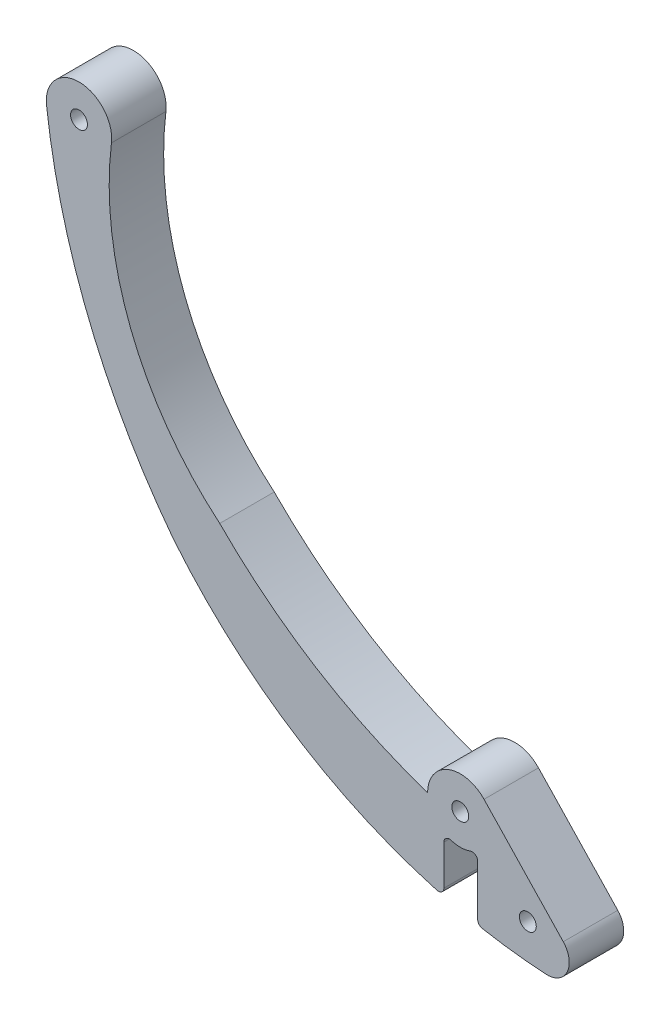
ISO-10303-21;
HEADER;
FILE_DESCRIPTION(('STEP AP214'),'2;1');
FILE_NAME('part.step','',(''),(''),'','','');
FILE_SCHEMA(('AUTOMOTIVE_DESIGN { 1 0 10303 214 1 1 1 1 }'));
ENDSEC;
DATA;
#1=APPLICATION_CONTEXT('core data for automotive mechanical design processes');
#2=APPLICATION_PROTOCOL_DEFINITION('international standard','automotive_design',2000,#1);
#3=PRODUCT_CONTEXT('',#1,'mechanical');
#4=PRODUCT('Part','Part','',(#3));
#5=PRODUCT_RELATED_PRODUCT_CATEGORY('part','',(#4));
#6=PRODUCT_DEFINITION_FORMATION('','',#4);
#7=PRODUCT_DEFINITION_CONTEXT('part definition',#1,'design');
#8=PRODUCT_DEFINITION('design','',#6,#7);
#9=PRODUCT_DEFINITION_SHAPE('','',#8);
#10=(LENGTH_UNIT() NAMED_UNIT(*) SI_UNIT(.MILLI.,.METRE.));
#11=(NAMED_UNIT(*) PLANE_ANGLE_UNIT() SI_UNIT($,.RADIAN.));
#12=(NAMED_UNIT(*) SI_UNIT($,.STERADIAN.) SOLID_ANGLE_UNIT());
#13=UNCERTAINTY_MEASURE_WITH_UNIT(LENGTH_MEASURE(1.E-05),#10,'distance_accuracy_value','');
#14=(GEOMETRIC_REPRESENTATION_CONTEXT(3) GLOBAL_UNCERTAINTY_ASSIGNED_CONTEXT((#13)) GLOBAL_UNIT_ASSIGNED_CONTEXT((#10,
#11,#12)) REPRESENTATION_CONTEXT('',''));
#15=CARTESIAN_POINT('',(0.,0.,0.));
#16=DIRECTION('',(0.,0.,1.));
#17=DIRECTION('',(1.,0.,0.));
#18=AXIS2_PLACEMENT_3D('',#15,#16,#17);
#19=CARTESIAN_POINT('',(5.31714943549073,91.2888214841465,5.));
#20=DIRECTION('',(0.,0.,-1.));
#21=DIRECTION('',(-1.,0.,0.));
#22=AXIS2_PLACEMENT_3D('',#19,#20,#21);
#23=CYLINDRICAL_SURFACE('',#22,95.4435399909895);
#24=CARTESIAN_POINT('',(5.31714943549073,91.2888214841465,-5.));
#25=DIRECTION('',(0.,0.,1.));
#26=DIRECTION('',(-1.,0.,0.));
#27=AXIS2_PLACEMENT_3D('',#24,#25,#26);
#28=CIRCLE('',#27,95.4435399909895);
#29=CARTESIAN_POINT('',(-68.6302344446018,30.9460195662554,-5.));
#30=VERTEX_POINT('',#29);
#31=CARTESIAN_POINT('',(-20.2811705058178,-0.657876891564754,-5.));
#32=VERTEX_POINT('',#31);
#33=EDGE_CURVE('E195',#30,#32,#28,.T.);
#34=ORIENTED_EDGE('',*,*,#33,.T.);
#35=DIRECTION('',(0.,0.,-1.));
#36=VECTOR('',#35,1.);
#37=CARTESIAN_POINT('',(-20.2811705058178,-0.657876891564754,5.));
#38=LINE('',#37,#36);
#39=CARTESIAN_POINT('',(-20.2811705058178,-0.657876891564754,5.));
#40=VERTEX_POINT('',#39);
#41=EDGE_CURVE('E250',#32,#40,#38,.F.);
#42=ORIENTED_EDGE('',*,*,#41,.T.);
#43=CARTESIAN_POINT('',(5.31714943549073,91.2888214841465,5.));
#44=DIRECTION('',(0.,0.,1.));
#45=DIRECTION('',(-1.,0.,0.));
#46=AXIS2_PLACEMENT_3D('',#43,#44,#45);
#47=CIRCLE('',#46,95.4435399909895);
#48=CARTESIAN_POINT('',(-68.6302344446018,30.9460195662554,5.));
#49=VERTEX_POINT('',#48);
#50=EDGE_CURVE('E221',#49,#40,#47,.T.);
#51=ORIENTED_EDGE('',*,*,#50,.F.);
#52=DIRECTION('',(0.,0.,-1.));
#53=VECTOR('',#52,1.);
#54=CARTESIAN_POINT('',(-68.6302344446018,30.9460195662554,5.));
#55=LINE('',#54,#53);
#56=EDGE_CURVE('E225',#49,#30,#55,.T.);
#57=ORIENTED_EDGE('',*,*,#56,.T.);
#58=EDGE_LOOP('',(#34,#42,#51,#57));
#59=FACE_BOUND('',#58,.T.);
#60=ADVANCED_FACE('F35',(#59),#23,.T.);
#61=CARTESIAN_POINT('',(0.,0.,5.));
#62=DIRECTION('',(0.,0.,1.));
#63=DIRECTION('',(1.,0.,0.));
#64=AXIS2_PLACEMENT_3D('',#61,#62,#63);
#65=PLANE('',#64);
#66=ORIENTED_EDGE('',*,*,#50,.T.);
#67=CARTESIAN_POINT('',(-20.0129667075961,0.305485305440847,5.));
#68=DIRECTION('',(0.,0.,1.));
#69=DIRECTION('',(1.,0.,0.));
#70=AXIS2_PLACEMENT_3D('',#67,#68,#69);
#71=CIRCLE('',#70,1.);
#72=CARTESIAN_POINT('',(-19.0129667075961,0.305485305440848,5.));
#73=VERTEX_POINT('',#72);
#74=EDGE_CURVE('E254',#40,#73,#71,.T.);
#75=ORIENTED_EDGE('',*,*,#74,.T.);
#76=DIRECTION('',(0.,-1.,0.));
#77=VECTOR('',#76,1.);
#78=CARTESIAN_POINT('',(-19.0129667075961,-1.00156140852289,5.));
#79=LINE('',#78,#77);
#80=CARTESIAN_POINT('',(-19.0129667075961,7.62743188194771,5.));
#81=VERTEX_POINT('',#80);
#82=EDGE_CURVE('E291',#81,#73,#79,.T.);
#83=ORIENTED_EDGE('',*,*,#82,.F.);
#84=CARTESIAN_POINT('',(-18.0129667075961,7.62743188194771,5.));
#85=DIRECTION('',(0.,0.,1.));
#86=DIRECTION('',(1.,0.,0.));
#87=AXIS2_PLACEMENT_3D('',#84,#85,#86);
#88=CIRCLE('',#87,1.);
#89=CARTESIAN_POINT('',(-17.7117568611961,8.58098976085789,5.));
#90=VERTEX_POINT('',#89);
#91=EDGE_CURVE('E261',#81,#90,#88,.F.);
#92=ORIENTED_EDGE('',*,*,#91,.T.);
#93=CARTESIAN_POINT('',(-16.,14.,5.));
#94=DIRECTION('',(0.,0.,-1.));
#95=DIRECTION('',(1.,0.,0.));
#96=AXIS2_PLACEMENT_3D('',#93,#94,#95);
#97=CIRCLE('',#96,5.68293793066394);
#98=CARTESIAN_POINT('',(-14.1336050231264,8.63228602531022,5.));
#99=VERTEX_POINT('',#98);
#100=EDGE_CURVE('E270',#99,#90,#97,.T.);
#101=ORIENTED_EDGE('',*,*,#100,.F.);
#102=CARTESIAN_POINT('',(-13.805184230986,7.68775451006584,5.));
#103=DIRECTION('',(0.,0.,1.));
#104=DIRECTION('',(1.,0.,0.));
#105=AXIS2_PLACEMENT_3D('',#102,#103,#104);
#106=CIRCLE('',#105,1.);
#107=CARTESIAN_POINT('',(-12.8051842309859,7.68775451006584,5.));
#108=VERTEX_POINT('',#107);
#109=EDGE_CURVE('E43',#99,#108,#106,.F.);
#110=ORIENTED_EDGE('',*,*,#109,.T.);
#111=DIRECTION('',(0.,1.,0.));
#112=VECTOR('',#111,1.);
#113=CARTESIAN_POINT('',(-12.8051842309859,-2.41843729815117,5.));
#114=LINE('',#113,#112);
#115=CARTESIAN_POINT('',(-12.8051842309859,-1.58963638334544,5.));
#116=VERTEX_POINT('',#115);
#117=EDGE_CURVE('E268',#116,#108,#114,.T.);
#118=ORIENTED_EDGE('',*,*,#117,.F.);
#119=CARTESIAN_POINT('',(-11.8051842309859,-1.58963638334544,5.));
#120=DIRECTION('',(0.,0.,1.));
#121=DIRECTION('',(1.,0.,0.));
#122=AXIS2_PLACEMENT_3D('',#119,#120,#121);
#123=CIRCLE('',#122,1.);
#124=CARTESIAN_POINT('',(-11.986481264834,-2.57306476686805,5.));
#125=VERTEX_POINT('',#124);
#126=EDGE_CURVE('E58',#116,#125,#123,.T.);
#127=ORIENTED_EDGE('',*,*,#126,.T.);
#128=CARTESIAN_POINT('',(-0.232587208938574,-3.99323217334503,5.));
#129=VERTEX_POINT('',#128);
#130=EDGE_CURVE('E220',#125,#129,#47,.T.);
#131=ORIENTED_EDGE('',*,*,#130,.T.);
#132=CARTESIAN_POINT('',(0.,0.,5.));
#133=DIRECTION('',(0.,0.,1.));
#134=DIRECTION('',(1.,0.,0.));
#135=AXIS2_PLACEMENT_3D('',#132,#133,#134);
#136=CIRCLE('',#135,3.99999999999999);
#137=CARTESIAN_POINT('',(2.90552342335605,2.74916962669263,5.));
#138=VERTEX_POINT('',#137);
#139=EDGE_CURVE('E207',#129,#138,#136,.T.);
#140=ORIENTED_EDGE('',*,*,#139,.T.);
#141=DIRECTION('',(-0.687292406673158,0.726380855839014,0.));
#142=VECTOR('',#141,1.);
#143=CARTESIAN_POINT('',(2.90552342335605,2.74916962669263,5.));
#144=LINE('',#143,#142);
#145=CARTESIAN_POINT('',(-11.6417148649659,18.123754440039,5.));
#146=VERTEX_POINT('',#145);
#147=EDGE_CURVE('E152',#138,#146,#144,.T.);
#148=ORIENTED_EDGE('',*,*,#147,.T.);
#149=CARTESIAN_POINT('',(-16.,14.,5.));
#150=DIRECTION('',(0.,0.,1.));
#151=DIRECTION('',(1.,0.,0.));
#152=AXIS2_PLACEMENT_3D('',#149,#150,#151);
#153=CIRCLE('',#152,6.);
#154=CARTESIAN_POINT('',(-22.,14.,5.));
#155=VERTEX_POINT('',#154);
#156=EDGE_CURVE('E210',#146,#155,#153,.T.);
#157=ORIENTED_EDGE('',*,*,#156,.T.);
#158=CARTESIAN_POINT('',(8.74913427491161,106.022299930331,5.));
#159=DIRECTION('',(0.,0.,-1.));
#160=DIRECTION('',(-1.,0.,0.));
#161=AXIS2_PLACEMENT_3D('',#158,#159,#160);
#162=CIRCLE('',#161,97.0237751436435);
#163=CARTESIAN_POINT('',(-60.1633996579984,37.7238694207662,5.));
#164=VERTEX_POINT('',#163);
#165=EDGE_CURVE('E212',#155,#164,#162,.T.);
#166=ORIENTED_EDGE('',*,*,#165,.T.);
#167=CARTESIAN_POINT('',(-23.3249717424258,81.396393712825,5.));
#168=DIRECTION('',(0.,0.,-1.));
#169=DIRECTION('',(1.,0.,0.));
#170=AXIS2_PLACEMENT_3D('',#167,#168,#169);
#171=CIRCLE('',#170,57.1345705272325);
#172=CARTESIAN_POINT('',(-80.0436726439243,88.2773905430564,5.));
#173=VERTEX_POINT('',#172);
#174=EDGE_CURVE('E214',#164,#173,#171,.T.);
#175=ORIENTED_EDGE('',*,*,#174,.T.);
#176=CARTESIAN_POINT('',(-86.,89.,5.));
#177=DIRECTION('',(0.,0.,1.));
#178=DIRECTION('',(1.,0.,0.));
#179=AXIS2_PLACEMENT_3D('',#176,#177,#178);
#180=CIRCLE('',#179,5.99999999999999);
#181=CARTESIAN_POINT('',(-91.9573603621302,88.2859569230645,5.));
#182=VERTEX_POINT('',#181);
#183=EDGE_CURVE('E216',#173,#182,#180,.T.);
#184=ORIENTED_EDGE('',*,*,#183,.T.);
#185=CARTESIAN_POINT('',(24.4862213513231,102.242764690578,5.));
#186=DIRECTION('',(0.,0.,1.));
#187=DIRECTION('',(1.,0.,0.));
#188=AXIS2_PLACEMENT_3D('',#185,#186,#187);
#189=CIRCLE('',#188,117.277023347785);
#190=EDGE_CURVE('E218',#182,#49,#189,.T.);
#191=ORIENTED_EDGE('',*,*,#190,.T.);
#192=EDGE_LOOP('',(#66,#75,#83,#92,#101,#110,#118,#127,#131,#140,#148,#157,#166,#175,#184,#191));
#193=FACE_BOUND('',#192,.T.);
#194=CARTESIAN_POINT('',(-16.,14.,5.));
#195=DIRECTION('',(0.,0.,1.));
#196=DIRECTION('',(1.,0.,0.));
#197=AXIS2_PLACEMENT_3D('',#194,#195,#196);
#198=CIRCLE('',#197,1.55);
#199=CARTESIAN_POINT('',(-14.45,14.,5.));
#200=VERTEX_POINT('',#199);
#201=EDGE_CURVE('E201',#200,#200,#198,.T.);
#202=ORIENTED_EDGE('',*,*,#201,.F.);
#203=EDGE_LOOP('',(#202));
#204=FACE_BOUND('',#203,.T.);
#205=CARTESIAN_POINT('',(-86.,89.,5.));
#206=DIRECTION('',(0.,0.,1.));
#207=DIRECTION('',(1.,0.,0.));
#208=AXIS2_PLACEMENT_3D('',#205,#206,#207);
#209=CIRCLE('',#208,1.54999999999999);
#210=CARTESIAN_POINT('',(-84.45,89.,5.));
#211=VERTEX_POINT('',#210);
#212=EDGE_CURVE('E204',#211,#211,#209,.T.);
#213=ORIENTED_EDGE('',*,*,#212,.F.);
#214=EDGE_LOOP('',(#213));
#215=FACE_BOUND('',#214,.T.);
#216=CARTESIAN_POINT('',(-3.6022,2.7054,5.));
#217=DIRECTION('',(0.,0.,1.));
#218=DIRECTION('',(1.,0.,0.));
#219=AXIS2_PLACEMENT_3D('',#216,#217,#218);
#220=CIRCLE('',#219,1.55);
#221=CARTESIAN_POINT('',(-2.0522,2.7054,5.));
#222=VERTEX_POINT('',#221);
#223=EDGE_CURVE('E198',#222,#222,#220,.T.);
#224=ORIENTED_EDGE('',*,*,#223,.F.);
#225=EDGE_LOOP('',(#224));
#226=FACE_BOUND('',#225,.T.);
#227=ADVANCED_FACE('F266',(#193,#204,#215,#226),#65,.T.);
#228=CARTESIAN_POINT('',(0.,0.,5.));
#229=DIRECTION('',(0.,0.,-1.));
#230=DIRECTION('',(-1.,0.,0.));
#231=AXIS2_PLACEMENT_3D('',#228,#229,#230);
#232=CYLINDRICAL_SURFACE('',#231,3.99999999999999);
#233=DIRECTION('',(0.,0.,-1.));
#234=VECTOR('',#233,1.);
#235=CARTESIAN_POINT('',(-0.232587208938574,-3.99323217334503,5.));
#236=LINE('',#235,#234);
#237=CARTESIAN_POINT('',(-0.232587208938574,-3.99323217334503,-5.));
#238=VERTEX_POINT('',#237);
#239=EDGE_CURVE('E173',#129,#238,#236,.T.);
#240=ORIENTED_EDGE('',*,*,#239,.T.);
#241=CARTESIAN_POINT('',(0.,0.,-5.));
#242=DIRECTION('',(0.,0.,1.));
#243=DIRECTION('',(1.,0.,0.));
#244=AXIS2_PLACEMENT_3D('',#241,#242,#243);
#245=CIRCLE('',#244,3.99999999999999);
#246=CARTESIAN_POINT('',(2.90552342335605,2.74916962669263,-5.));
#247=VERTEX_POINT('',#246);
#248=EDGE_CURVE('E165',#238,#247,#245,.T.);
#249=ORIENTED_EDGE('',*,*,#248,.T.);
#250=DIRECTION('',(0.,0.,-1.));
#251=VECTOR('',#250,1.);
#252=CARTESIAN_POINT('',(2.90552342335605,2.74916962669263,5.));
#253=LINE('',#252,#251);
#254=EDGE_CURVE('E147',#138,#247,#253,.T.);
#255=ORIENTED_EDGE('',*,*,#254,.F.);
#256=ORIENTED_EDGE('',*,*,#139,.F.);
#257=EDGE_LOOP('',(#240,#249,#255,#256));
#258=FACE_BOUND('',#257,.T.);
#259=ADVANCED_FACE('F171',(#258),#232,.T.);
#260=CARTESIAN_POINT('',(2.90552342335605,2.74916962669263,5.));
#261=DIRECTION('',(-0.726380855839014,-0.687292406673158,0.));
#262=DIRECTION('',(0.687292406673158,-0.726380855839014,0.));
#263=AXIS2_PLACEMENT_3D('',#260,#261,#262);
#264=PLANE('',#263);
#265=ORIENTED_EDGE('',*,*,#254,.T.);
#266=DIRECTION('',(-0.687292406673158,0.726380855839014,0.));
#267=VECTOR('',#266,1.);
#268=CARTESIAN_POINT('',(2.90552342335605,2.74916962669263,-5.));
#269=LINE('',#268,#267);
#270=CARTESIAN_POINT('',(-11.6417148649659,18.123754440039,-5.));
#271=VERTEX_POINT('',#270);
#272=EDGE_CURVE('E151',#247,#271,#269,.T.);
#273=ORIENTED_EDGE('',*,*,#272,.T.);
#274=DIRECTION('',(0.,0.,-1.));
#275=VECTOR('',#274,1.);
#276=CARTESIAN_POINT('',(-11.6417148649659,18.123754440039,5.));
#277=LINE('',#276,#275);
#278=EDGE_CURVE('E158',#146,#271,#277,.T.);
#279=ORIENTED_EDGE('',*,*,#278,.F.);
#280=ORIENTED_EDGE('',*,*,#147,.F.);
#281=EDGE_LOOP('',(#265,#273,#279,#280));
#282=FACE_BOUND('',#281,.T.);
#283=ADVANCED_FACE('F149',(#282),#264,.F.);
#284=CARTESIAN_POINT('',(-16.,14.,5.));
#285=DIRECTION('',(0.,0.,-1.));
#286=DIRECTION('',(-1.,0.,0.));
#287=AXIS2_PLACEMENT_3D('',#284,#285,#286);
#288=CYLINDRICAL_SURFACE('',#287,6.);
#289=ORIENTED_EDGE('',*,*,#278,.T.);
#290=CARTESIAN_POINT('',(-16.,14.,-5.));
#291=DIRECTION('',(0.,0.,1.));
#292=DIRECTION('',(1.,0.,0.));
#293=AXIS2_PLACEMENT_3D('',#290,#291,#292);
#294=CIRCLE('',#293,6.);
#295=CARTESIAN_POINT('',(-22.,14.,-5.));
#296=VERTEX_POINT('',#295);
#297=EDGE_CURVE('E168',#271,#296,#294,.T.);
#298=ORIENTED_EDGE('',*,*,#297,.T.);
#299=DIRECTION('',(0.,0.,-1.));
#300=VECTOR('',#299,1.);
#301=CARTESIAN_POINT('',(-22.,14.,5.));
#302=LINE('',#301,#300);
#303=EDGE_CURVE('E233',#155,#296,#302,.T.);
#304=ORIENTED_EDGE('',*,*,#303,.F.);
#305=ORIENTED_EDGE('',*,*,#156,.F.);
#306=EDGE_LOOP('',(#289,#298,#304,#305));
#307=FACE_BOUND('',#306,.T.);
#308=ADVANCED_FACE('F361',(#307),#288,.T.);
#309=CARTESIAN_POINT('',(8.74913427491161,106.022299930331,5.));
#310=DIRECTION('',(0.,0.,-1.));
#311=DIRECTION('',(-1.,0.,0.));
#312=AXIS2_PLACEMENT_3D('',#309,#310,#311);
#313=CYLINDRICAL_SURFACE('',#312,97.0237751436435);
#314=ORIENTED_EDGE('',*,*,#303,.T.);
#315=CARTESIAN_POINT('',(8.74913427491161,106.022299930331,-5.));
#316=DIRECTION('',(0.,0.,-1.));
#317=DIRECTION('',(-1.,0.,0.));
#318=AXIS2_PLACEMENT_3D('',#315,#316,#317);
#319=CIRCLE('',#318,97.0237751436435);
#320=CARTESIAN_POINT('',(-60.1633996579984,37.7238694207662,-5.));
#321=VERTEX_POINT('',#320);
#322=EDGE_CURVE('E182',#296,#321,#319,.T.);
#323=ORIENTED_EDGE('',*,*,#322,.T.);
#324=DIRECTION('',(0.,0.,-1.));
#325=VECTOR('',#324,1.);
#326=CARTESIAN_POINT('',(-60.1633996579984,37.7238694207662,5.));
#327=LINE('',#326,#325);
#328=EDGE_CURVE('E231',#164,#321,#327,.T.);
#329=ORIENTED_EDGE('',*,*,#328,.F.);
#330=ORIENTED_EDGE('',*,*,#165,.F.);
#331=EDGE_LOOP('',(#314,#323,#329,#330));
#332=FACE_BOUND('',#331,.T.);
#333=ADVANCED_FACE('F364',(#332),#313,.F.);
#334=CARTESIAN_POINT('',(-23.3249717424258,81.396393712825,5.));
#335=DIRECTION('',(0.,0.,-1.));
#336=DIRECTION('',(-1.,0.,0.));
#337=AXIS2_PLACEMENT_3D('',#334,#335,#336);
#338=CYLINDRICAL_SURFACE('',#337,57.1345705272325);
#339=ORIENTED_EDGE('',*,*,#328,.T.);
#340=CARTESIAN_POINT('',(-23.3249717424258,81.396393712825,-5.));
#341=DIRECTION('',(0.,0.,-1.));
#342=DIRECTION('',(1.,0.,0.));
#343=AXIS2_PLACEMENT_3D('',#340,#341,#342);
#344=CIRCLE('',#343,57.1345705272325);
#345=CARTESIAN_POINT('',(-80.0436726439243,88.2773905430564,-5.));
#346=VERTEX_POINT('',#345);
#347=EDGE_CURVE('E185',#321,#346,#344,.T.);
#348=ORIENTED_EDGE('',*,*,#347,.T.);
#349=DIRECTION('',(0.,0.,-1.));
#350=VECTOR('',#349,1.);
#351=CARTESIAN_POINT('',(-80.0436726439243,88.2773905430564,5.));
#352=LINE('',#351,#350);
#353=EDGE_CURVE('E229',#173,#346,#352,.T.);
#354=ORIENTED_EDGE('',*,*,#353,.F.);
#355=ORIENTED_EDGE('',*,*,#174,.F.);
#356=EDGE_LOOP('',(#339,#348,#354,#355));
#357=FACE_BOUND('',#356,.T.);
#358=ADVANCED_FACE('F368',(#357),#338,.F.);
#359=CARTESIAN_POINT('',(-86.,89.,5.));
#360=DIRECTION('',(0.,0.,-1.));
#361=DIRECTION('',(-1.,0.,0.));
#362=AXIS2_PLACEMENT_3D('',#359,#360,#361);
#363=CYLINDRICAL_SURFACE('',#362,5.99999999999999);
#364=ORIENTED_EDGE('',*,*,#353,.T.);
#365=CARTESIAN_POINT('',(-86.,89.,-5.));
#366=DIRECTION('',(0.,0.,1.));
#367=DIRECTION('',(1.,0.,0.));
#368=AXIS2_PLACEMENT_3D('',#365,#366,#367);
#369=CIRCLE('',#368,5.99999999999999);
#370=CARTESIAN_POINT('',(-91.9573603621302,88.2859569230645,-5.));
#371=VERTEX_POINT('',#370);
#372=EDGE_CURVE('E188',#346,#371,#369,.T.);
#373=ORIENTED_EDGE('',*,*,#372,.T.);
#374=DIRECTION('',(0.,0.,-1.));
#375=VECTOR('',#374,1.);
#376=CARTESIAN_POINT('',(-91.9573603621302,88.2859569230645,5.));
#377=LINE('',#376,#375);
#378=EDGE_CURVE('E227',#182,#371,#377,.T.);
#379=ORIENTED_EDGE('',*,*,#378,.F.);
#380=ORIENTED_EDGE('',*,*,#183,.F.);
#381=EDGE_LOOP('',(#364,#373,#379,#380));
#382=FACE_BOUND('',#381,.T.);
#383=ADVANCED_FACE('F337',(#382),#363,.T.);
#384=CARTESIAN_POINT('',(24.4862213513231,102.242764690578,5.));
#385=DIRECTION('',(0.,0.,-1.));
#386=DIRECTION('',(-1.,0.,0.));
#387=AXIS2_PLACEMENT_3D('',#384,#385,#386);
#388=CYLINDRICAL_SURFACE('',#387,117.277023347785);
#389=ORIENTED_EDGE('',*,*,#378,.T.);
#390=CARTESIAN_POINT('',(24.4862213513231,102.242764690578,-5.));
#391=DIRECTION('',(0.,0.,1.));
#392=DIRECTION('',(1.,0.,0.));
#393=AXIS2_PLACEMENT_3D('',#390,#391,#392);
#394=CIRCLE('',#393,117.277023347785);
#395=EDGE_CURVE('E191',#371,#30,#394,.T.);
#396=ORIENTED_EDGE('',*,*,#395,.T.);
#397=ORIENTED_EDGE('',*,*,#56,.F.);
#398=ORIENTED_EDGE('',*,*,#190,.F.);
#399=EDGE_LOOP('',(#389,#396,#397,#398));
#400=FACE_BOUND('',#399,.T.);
#401=ADVANCED_FACE('F332',(#400),#388,.T.);
#402=ORIENTED_EDGE('',*,*,#130,.F.);
#403=DIRECTION('',(0.,0.,-1.));
#404=VECTOR('',#403,1.);
#405=CARTESIAN_POINT('',(-11.986481264834,-2.57306476686808,5.));
#406=LINE('',#405,#404);
#407=CARTESIAN_POINT('',(-11.986481264834,-2.57306476686805,-5.));
#408=VERTEX_POINT('',#407);
#409=EDGE_CURVE('E50',#125,#408,#406,.T.);
#410=ORIENTED_EDGE('',*,*,#409,.T.);
#411=EDGE_CURVE('E194',#408,#238,#28,.T.);
#412=ORIENTED_EDGE('',*,*,#411,.T.);
#413=ORIENTED_EDGE('',*,*,#239,.F.);
#414=EDGE_LOOP('',(#402,#410,#412,#413));
#415=FACE_BOUND('',#414,.T.);
#416=ADVANCED_FACE('F319',(#415),#23,.T.);
#417=CARTESIAN_POINT('',(-86.,89.,5.));
#418=DIRECTION('',(0.,0.,-1.));
#419=DIRECTION('',(-1.,0.,0.));
#420=AXIS2_PLACEMENT_3D('',#417,#418,#419);
#421=CYLINDRICAL_SURFACE('',#420,1.54999999999999);
#422=ORIENTED_EDGE('',*,*,#212,.T.);
#423=EDGE_LOOP('',(#422));
#424=FACE_BOUND('',#423,.T.);
#425=CARTESIAN_POINT('',(-86.,89.,-5.));
#426=DIRECTION('',(0.,0.,1.));
#427=DIRECTION('',(1.,0.,0.));
#428=AXIS2_PLACEMENT_3D('',#425,#426,#427);
#429=CIRCLE('',#428,1.54999999999999);
#430=CARTESIAN_POINT('',(-84.45,89.,-5.));
#431=VERTEX_POINT('',#430);
#432=EDGE_CURVE('E174',#431,#431,#429,.T.);
#433=ORIENTED_EDGE('',*,*,#432,.F.);
#434=EDGE_LOOP('',(#433));
#435=FACE_BOUND('',#434,.T.);
#436=ADVANCED_FACE('F310',(#424,#435),#421,.F.);
#437=CARTESIAN_POINT('',(-16.,14.,5.));
#438=DIRECTION('',(0.,0.,-1.));
#439=DIRECTION('',(-1.,0.,0.));
#440=AXIS2_PLACEMENT_3D('',#437,#438,#439);
#441=CYLINDRICAL_SURFACE('',#440,1.55);
#442=ORIENTED_EDGE('',*,*,#201,.T.);
#443=EDGE_LOOP('',(#442));
#444=FACE_BOUND('',#443,.T.);
#445=CARTESIAN_POINT('',(-16.,14.,-5.));
#446=DIRECTION('',(0.,0.,1.));
#447=DIRECTION('',(1.,0.,0.));
#448=AXIS2_PLACEMENT_3D('',#445,#446,#447);
#449=CIRCLE('',#448,1.55);
#450=CARTESIAN_POINT('',(-14.45,14.,-5.));
#451=VERTEX_POINT('',#450);
#452=EDGE_CURVE('E177',#451,#451,#449,.T.);
#453=ORIENTED_EDGE('',*,*,#452,.F.);
#454=EDGE_LOOP('',(#453));
#455=FACE_BOUND('',#454,.T.);
#456=ADVANCED_FACE('F307',(#444,#455),#441,.F.);
#457=CARTESIAN_POINT('',(-3.6022,2.7054,5.));
#458=DIRECTION('',(0.,0.,-1.));
#459=DIRECTION('',(-1.,0.,0.));
#460=AXIS2_PLACEMENT_3D('',#457,#458,#459);
#461=CYLINDRICAL_SURFACE('',#460,1.55);
#462=ORIENTED_EDGE('',*,*,#223,.T.);
#463=EDGE_LOOP('',(#462));
#464=FACE_BOUND('',#463,.T.);
#465=CARTESIAN_POINT('',(-3.6022,2.7054,-5.));
#466=DIRECTION('',(0.,0.,1.));
#467=DIRECTION('',(1.,0.,0.));
#468=AXIS2_PLACEMENT_3D('',#465,#466,#467);
#469=CIRCLE('',#468,1.55);
#470=CARTESIAN_POINT('',(-2.0522,2.7054,-5.));
#471=VERTEX_POINT('',#470);
#472=EDGE_CURVE('E300',#471,#471,#469,.T.);
#473=ORIENTED_EDGE('',*,*,#472,.F.);
#474=EDGE_LOOP('',(#473));
#475=FACE_BOUND('',#474,.T.);
#476=ADVANCED_FACE('F309',(#464,#475),#461,.F.);
#477=CARTESIAN_POINT('',(0.,0.,-5.));
#478=DIRECTION('',(0.,0.,1.));
#479=DIRECTION('',(1.,0.,0.));
#480=AXIS2_PLACEMENT_3D('',#477,#478,#479);
#481=PLANE('',#480);
#482=ORIENTED_EDGE('',*,*,#472,.T.);
#483=EDGE_LOOP('',(#482));
#484=FACE_BOUND('',#483,.T.);
#485=ORIENTED_EDGE('',*,*,#452,.T.);
#486=EDGE_LOOP('',(#485));
#487=FACE_BOUND('',#486,.T.);
#488=ORIENTED_EDGE('',*,*,#432,.T.);
#489=EDGE_LOOP('',(#488));
#490=FACE_BOUND('',#489,.T.);
#491=DIRECTION('',(0.,1.,0.));
#492=VECTOR('',#491,1.);
#493=CARTESIAN_POINT('',(-19.0129667075961,-1.00156140852289,-5.));
#494=LINE('',#493,#492);
#495=CARTESIAN_POINT('',(-19.0129667075961,0.305485305440848,-5.));
#496=VERTEX_POINT('',#495);
#497=CARTESIAN_POINT('',(-19.0129667075961,7.62743188194771,-5.));
#498=VERTEX_POINT('',#497);
#499=EDGE_CURVE('E290',#496,#498,#494,.T.);
#500=ORIENTED_EDGE('',*,*,#499,.F.);
#501=CARTESIAN_POINT('',(-20.0129667075961,0.305485305440847,-5.));
#502=DIRECTION('',(0.,0.,1.));
#503=DIRECTION('',(1.,0.,0.));
#504=AXIS2_PLACEMENT_3D('',#501,#502,#503);
#505=CIRCLE('',#504,1.);
#506=EDGE_CURVE('E258',#496,#32,#505,.F.);
#507=ORIENTED_EDGE('',*,*,#506,.T.);
#508=ORIENTED_EDGE('',*,*,#33,.F.);
#509=ORIENTED_EDGE('',*,*,#395,.F.);
#510=ORIENTED_EDGE('',*,*,#372,.F.);
#511=ORIENTED_EDGE('',*,*,#347,.F.);
#512=ORIENTED_EDGE('',*,*,#322,.F.);
#513=ORIENTED_EDGE('',*,*,#297,.F.);
#514=ORIENTED_EDGE('',*,*,#272,.F.);
#515=ORIENTED_EDGE('',*,*,#248,.F.);
#516=ORIENTED_EDGE('',*,*,#411,.F.);
#517=CARTESIAN_POINT('',(-11.8051842309859,-1.58963638334544,-5.));
#518=DIRECTION('',(0.,0.,1.));
#519=DIRECTION('',(1.,0.,0.));
#520=AXIS2_PLACEMENT_3D('',#517,#518,#519);
#521=CIRCLE('',#520,1.);
#522=CARTESIAN_POINT('',(-12.8051842309859,-1.58963638334544,-5.));
#523=VERTEX_POINT('',#522);
#524=EDGE_CURVE('E256',#408,#523,#521,.F.);
#525=ORIENTED_EDGE('',*,*,#524,.T.);
#526=DIRECTION('',(0.,-1.,0.));
#527=VECTOR('',#526,1.);
#528=CARTESIAN_POINT('',(-12.8051842309859,-2.41843729815117,-5.));
#529=LINE('',#528,#527);
#530=CARTESIAN_POINT('',(-12.8051842309859,7.68775451006584,-5.));
#531=VERTEX_POINT('',#530);
#532=EDGE_CURVE('E286',#531,#523,#529,.T.);
#533=ORIENTED_EDGE('',*,*,#532,.F.);
#534=CARTESIAN_POINT('',(-13.805184230986,7.68775451006584,-5.));
#535=DIRECTION('',(0.,0.,1.));
#536=DIRECTION('',(1.,0.,0.));
#537=AXIS2_PLACEMENT_3D('',#534,#535,#536);
#538=CIRCLE('',#537,1.);
#539=CARTESIAN_POINT('',(-14.1336050231264,8.63228602531022,-5.));
#540=VERTEX_POINT('',#539);
#541=EDGE_CURVE('E11',#531,#540,#538,.T.);
#542=ORIENTED_EDGE('',*,*,#541,.T.);
#543=CARTESIAN_POINT('',(-16.,14.,-5.));
#544=DIRECTION('',(0.,0.,1.));
#545=DIRECTION('',(1.,0.,0.));
#546=AXIS2_PLACEMENT_3D('',#543,#544,#545);
#547=CIRCLE('',#546,5.68293793066394);
#548=CARTESIAN_POINT('',(-17.7117568611961,8.58098976085789,-5.));
#549=VERTEX_POINT('',#548);
#550=EDGE_CURVE('E284',#549,#540,#547,.T.);
#551=ORIENTED_EDGE('',*,*,#550,.F.);
#552=CARTESIAN_POINT('',(-18.0129667075961,7.62743188194771,-5.));
#553=DIRECTION('',(0.,0.,1.));
#554=DIRECTION('',(1.,0.,0.));
#555=AXIS2_PLACEMENT_3D('',#552,#553,#554);
#556=CIRCLE('',#555,1.);
#557=EDGE_CURVE('E263',#549,#498,#556,.T.);
#558=ORIENTED_EDGE('',*,*,#557,.T.);
#559=EDGE_LOOP('',(#500,#507,#508,#509,#510,#511,#512,#513,#514,#515,#516,#525,#533,#542,#551,#558));
#560=FACE_BOUND('',#559,.T.);
#561=ADVANCED_FACE('F164',(#484,#487,#490,#560),#481,.F.);
#562=CARTESIAN_POINT('',(-19.0129667075961,-1.00156140852289,-18.261258973819));
#563=DIRECTION('',(-1.,0.,0.));
#564=DIRECTION('',(0.,-1.,0.));
#565=AXIS2_PLACEMENT_3D('',#562,#563,#564);
#566=PLANE('',#565);
#567=ORIENTED_EDGE('',*,*,#499,.T.);
#568=DIRECTION('',(0.,0.,-1.));
#569=VECTOR('',#568,1.);
#570=CARTESIAN_POINT('',(-19.0129667075961,7.62743188194771,5.));
#571=LINE('',#570,#569);
#572=EDGE_CURVE('E237',#498,#81,#571,.F.);
#573=ORIENTED_EDGE('',*,*,#572,.T.);
#574=ORIENTED_EDGE('',*,*,#82,.T.);
#575=DIRECTION('',(0.,0.,-1.));
#576=VECTOR('',#575,1.);
#577=CARTESIAN_POINT('',(-19.0129667075961,0.305485305440848,-18.261258973819));
#578=LINE('',#577,#576);
#579=EDGE_CURVE('E157',#73,#496,#578,.T.);
#580=ORIENTED_EDGE('',*,*,#579,.T.);
#581=EDGE_LOOP('',(#567,#573,#574,#580));
#582=FACE_BOUND('',#581,.T.);
#583=ADVANCED_FACE('F396',(#582),#566,.F.);
#584=CARTESIAN_POINT('',(-16.,14.,-18.261258973819));
#585=DIRECTION('',(0.,0.,1.));
#586=DIRECTION('',(1.,0.,0.));
#587=AXIS2_PLACEMENT_3D('',#584,#585,#586);
#588=CYLINDRICAL_SURFACE('',#587,5.68293793066394);
#589=ORIENTED_EDGE('',*,*,#100,.T.);
#590=DIRECTION('',(0.,0.,1.));
#591=VECTOR('',#590,1.);
#592=CARTESIAN_POINT('',(-17.7117568611961,8.58098976085789,-18.261258973819));
#593=LINE('',#592,#591);
#594=EDGE_CURVE('E243',#90,#549,#593,.F.);
#595=ORIENTED_EDGE('',*,*,#594,.T.);
#596=ORIENTED_EDGE('',*,*,#550,.T.);
#597=DIRECTION('',(0.,0.,1.));
#598=VECTOR('',#597,1.);
#599=CARTESIAN_POINT('',(-14.1336050231264,8.63228602531022,-18.261258973819));
#600=LINE('',#599,#598);
#601=EDGE_CURVE('E240',#540,#99,#600,.T.);
#602=ORIENTED_EDGE('',*,*,#601,.T.);
#603=EDGE_LOOP('',(#589,#595,#596,#602));
#604=FACE_BOUND('',#603,.T.);
#605=ADVANCED_FACE('F288',(#604),#588,.T.);
#606=CARTESIAN_POINT('',(-12.8051842309859,-2.41843729815117,-18.261258973819));
#607=DIRECTION('',(1.,0.,0.));
#608=DIRECTION('',(0.,0.,-1.));
#609=AXIS2_PLACEMENT_3D('',#606,#607,#608);
#610=PLANE('',#609);
#611=ORIENTED_EDGE('',*,*,#117,.T.);
#612=DIRECTION('',(0.,0.,-1.));
#613=VECTOR('',#612,1.);
#614=CARTESIAN_POINT('',(-12.8051842309859,7.68775451006584,-5.));
#615=LINE('',#614,#613);
#616=EDGE_CURVE('E248',#108,#531,#615,.T.);
#617=ORIENTED_EDGE('',*,*,#616,.T.);
#618=ORIENTED_EDGE('',*,*,#532,.T.);
#619=DIRECTION('',(0.,0.,-1.));
#620=VECTOR('',#619,1.);
#621=CARTESIAN_POINT('',(-12.8051842309859,-1.58963638334544,-18.261258973819));
#622=LINE('',#621,#620);
#623=EDGE_CURVE('E245',#523,#116,#622,.F.);
#624=ORIENTED_EDGE('',*,*,#623,.T.);
#625=EDGE_LOOP('',(#611,#617,#618,#624));
#626=FACE_BOUND('',#625,.T.);
#627=ADVANCED_FACE('F275',(#626),#610,.F.);
#628=CARTESIAN_POINT('',(-18.0129667075961,7.62743188194771,-18.261258973819));
#629=DIRECTION('',(0.,0.,1.));
#630=DIRECTION('',(1.,0.,0.));
#631=AXIS2_PLACEMENT_3D('',#628,#629,#630);
#632=CYLINDRICAL_SURFACE('',#631,1.);
#633=ORIENTED_EDGE('',*,*,#557,.F.);
#634=ORIENTED_EDGE('',*,*,#594,.F.);
#635=ORIENTED_EDGE('',*,*,#91,.F.);
#636=ORIENTED_EDGE('',*,*,#572,.F.);
#637=EDGE_LOOP('',(#633,#634,#635,#636));
#638=FACE_BOUND('',#637,.T.);
#639=ADVANCED_FACE('F350',(#638),#632,.F.);
#640=CARTESIAN_POINT('',(-13.805184230986,7.68775451006584,-18.261258973819));
#641=DIRECTION('',(0.,0.,1.));
#642=DIRECTION('',(1.,0.,0.));
#643=AXIS2_PLACEMENT_3D('',#640,#641,#642);
#644=CYLINDRICAL_SURFACE('',#643,1.);
#645=ORIENTED_EDGE('',*,*,#541,.F.);
#646=ORIENTED_EDGE('',*,*,#616,.F.);
#647=ORIENTED_EDGE('',*,*,#109,.F.);
#648=ORIENTED_EDGE('',*,*,#601,.F.);
#649=EDGE_LOOP('',(#645,#646,#647,#648));
#650=FACE_BOUND('',#649,.T.);
#651=ADVANCED_FACE('F281',(#650),#644,.F.);
#652=CARTESIAN_POINT('',(-20.0129667075961,0.305485305440847,5.));
#653=DIRECTION('',(0.,0.,-1.));
#654=DIRECTION('',(-1.,0.,0.));
#655=AXIS2_PLACEMENT_3D('',#652,#653,#654);
#656=CYLINDRICAL_SURFACE('',#655,1.);
#657=ORIENTED_EDGE('',*,*,#506,.F.);
#658=ORIENTED_EDGE('',*,*,#579,.F.);
#659=ORIENTED_EDGE('',*,*,#74,.F.);
#660=ORIENTED_EDGE('',*,*,#41,.F.);
#661=EDGE_LOOP('',(#657,#658,#659,#660));
#662=FACE_BOUND('',#661,.T.);
#663=ADVANCED_FACE('F342',(#662),#656,.T.);
#664=CARTESIAN_POINT('',(-11.8051842309859,-1.58963638334544,5.));
#665=DIRECTION('',(0.,0.,-1.));
#666=DIRECTION('',(-1.,0.,0.));
#667=AXIS2_PLACEMENT_3D('',#664,#665,#666);
#668=CYLINDRICAL_SURFACE('',#667,1.);
#669=ORIENTED_EDGE('',*,*,#524,.F.);
#670=ORIENTED_EDGE('',*,*,#409,.F.);
#671=ORIENTED_EDGE('',*,*,#126,.F.);
#672=ORIENTED_EDGE('',*,*,#623,.F.);
#673=EDGE_LOOP('',(#669,#670,#671,#672));
#674=FACE_BOUND('',#673,.T.);
#675=ADVANCED_FACE('F37',(#674),#668,.T.);
#676=CLOSED_SHELL('',(#60,#227,#259,#283,#308,#333,#358,#383,#401,#416,#436,#456,#476,#561,#583,
#605,#627,#639,#651,#663,#675));
#677=MANIFOLD_SOLID_BREP('B2',#676);
#678=ADVANCED_BREP_SHAPE_REPRESENTATION('',(#18,#677),#14);
#679=SHAPE_DEFINITION_REPRESENTATION(#9,#678);
ENDSEC;
END-ISO-10303-21;
